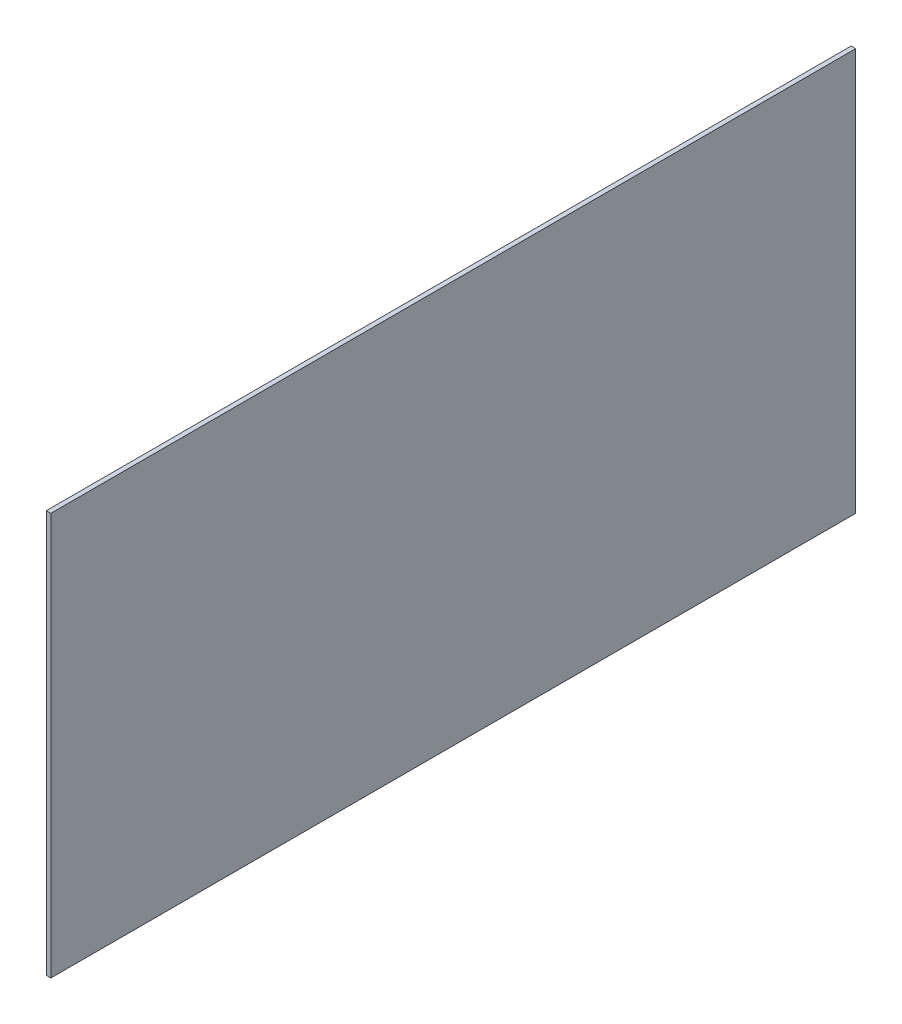
ISO-10303-21;
HEADER;
FILE_DESCRIPTION(('STEP AP214'),'2;1');
FILE_NAME('part.step','',(''),(''),'','','');
FILE_SCHEMA(('AUTOMOTIVE_DESIGN { 1 0 10303 214 1 1 1 1 }'));
ENDSEC;
DATA;
#1=APPLICATION_CONTEXT('core data for automotive mechanical design processes');
#2=APPLICATION_PROTOCOL_DEFINITION('international standard','automotive_design',2000,#1);
#3=PRODUCT_CONTEXT('',#1,'mechanical');
#4=PRODUCT('Part','Part','',(#3));
#5=PRODUCT_RELATED_PRODUCT_CATEGORY('part','',(#4));
#6=PRODUCT_DEFINITION_FORMATION('','',#4);
#7=PRODUCT_DEFINITION_CONTEXT('part definition',#1,'design');
#8=PRODUCT_DEFINITION('design','',#6,#7);
#9=PRODUCT_DEFINITION_SHAPE('','',#8);
#10=(LENGTH_UNIT() NAMED_UNIT(*) SI_UNIT(.MILLI.,.METRE.));
#11=(NAMED_UNIT(*) PLANE_ANGLE_UNIT() SI_UNIT($,.RADIAN.));
#12=(NAMED_UNIT(*) SI_UNIT($,.STERADIAN.) SOLID_ANGLE_UNIT());
#13=UNCERTAINTY_MEASURE_WITH_UNIT(LENGTH_MEASURE(1.E-05),#10,'distance_accuracy_value','');
#14=(GEOMETRIC_REPRESENTATION_CONTEXT(3) GLOBAL_UNCERTAINTY_ASSIGNED_CONTEXT((#13)) GLOBAL_UNIT_ASSIGNED_CONTEXT((#10,
#11,#12)) REPRESENTATION_CONTEXT('',''));
#15=CARTESIAN_POINT('',(0.,0.,0.));
#16=DIRECTION('',(0.,0.,1.));
#17=DIRECTION('',(1.,0.,0.));
#18=AXIS2_PLACEMENT_3D('',#15,#16,#17);
#19=CARTESIAN_POINT('',(1.5875,0.,0.));
#20=DIRECTION('',(0.,0.,-1.));
#21=DIRECTION('',(-1.,0.,0.));
#22=AXIS2_PLACEMENT_3D('',#19,#20,#21);
#23=PLANE('',#22);
#24=DIRECTION('',(0.,-1.,0.));
#25=VECTOR('',#24,1.);
#26=CARTESIAN_POINT('',(0.,0.,0.));
#27=LINE('',#26,#25);
#28=CARTESIAN_POINT('',(0.,139.7,0.));
#29=VERTEX_POINT('',#28);
#30=CARTESIAN_POINT('',(0.,0.,0.));
#31=VERTEX_POINT('',#30);
#32=EDGE_CURVE('E96',#29,#31,#27,.T.);
#33=ORIENTED_EDGE('',*,*,#32,.T.);
#34=DIRECTION('',(-1.,0.,0.));
#35=VECTOR('',#34,1.);
#36=CARTESIAN_POINT('',(1.5875,0.,0.));
#37=LINE('',#36,#35);
#38=CARTESIAN_POINT('',(1.5875,0.,0.));
#39=VERTEX_POINT('',#38);
#40=EDGE_CURVE('E11',#39,#31,#37,.T.);
#41=ORIENTED_EDGE('',*,*,#40,.F.);
#42=DIRECTION('',(0.,-1.,0.));
#43=VECTOR('',#42,1.);
#44=CARTESIAN_POINT('',(1.5875,0.,0.));
#45=LINE('',#44,#43);
#46=CARTESIAN_POINT('',(1.5875,139.7,0.));
#47=VERTEX_POINT('',#46);
#48=EDGE_CURVE('E84',#47,#39,#45,.T.);
#49=ORIENTED_EDGE('',*,*,#48,.F.);
#50=DIRECTION('',(-1.,0.,0.));
#51=VECTOR('',#50,1.);
#52=CARTESIAN_POINT('',(1.5875,139.7,0.));
#53=LINE('',#52,#51);
#54=EDGE_CURVE('E92',#47,#29,#53,.T.);
#55=ORIENTED_EDGE('',*,*,#54,.T.);
#56=EDGE_LOOP('',(#33,#41,#49,#55));
#57=FACE_BOUND('',#56,.T.);
#58=ADVANCED_FACE('F33',(#57),#23,.F.);
#59=CARTESIAN_POINT('',(1.5875,0.,0.));
#60=DIRECTION('',(0.,1.,0.));
#61=DIRECTION('',(0.,0.,1.));
#62=AXIS2_PLACEMENT_3D('',#59,#60,#61);
#63=PLANE('',#62);
#64=DIRECTION('',(0.,0.,-1.));
#65=VECTOR('',#64,1.);
#66=CARTESIAN_POINT('',(0.,0.,0.));
#67=LINE('',#66,#65);
#68=CARTESIAN_POINT('',(0.,0.,-279.4));
#69=VERTEX_POINT('',#68);
#70=EDGE_CURVE('E88',#31,#69,#67,.T.);
#71=ORIENTED_EDGE('',*,*,#70,.T.);
#72=DIRECTION('',(-1.,0.,0.));
#73=VECTOR('',#72,1.);
#74=CARTESIAN_POINT('',(1.5875,0.,-279.4));
#75=LINE('',#74,#73);
#76=CARTESIAN_POINT('',(1.5875,0.,-279.4));
#77=VERTEX_POINT('',#76);
#78=EDGE_CURVE('E41',#77,#69,#75,.T.);
#79=ORIENTED_EDGE('',*,*,#78,.F.);
#80=DIRECTION('',(0.,0.,-1.));
#81=VECTOR('',#80,1.);
#82=CARTESIAN_POINT('',(1.5875,0.,0.));
#83=LINE('',#82,#81);
#84=EDGE_CURVE('E79',#39,#77,#83,.T.);
#85=ORIENTED_EDGE('',*,*,#84,.F.);
#86=ORIENTED_EDGE('',*,*,#40,.T.);
#87=EDGE_LOOP('',(#71,#79,#85,#86));
#88=FACE_BOUND('',#87,.T.);
#89=ADVANCED_FACE('F87',(#88),#63,.F.);
#90=CARTESIAN_POINT('',(1.5875,0.,-279.4));
#91=DIRECTION('',(0.,0.,1.));
#92=DIRECTION('',(1.,0.,0.));
#93=AXIS2_PLACEMENT_3D('',#90,#91,#92);
#94=PLANE('',#93);
#95=DIRECTION('',(0.,1.,0.));
#96=VECTOR('',#95,1.);
#97=CARTESIAN_POINT('',(0.,0.,-279.4));
#98=LINE('',#97,#96);
#99=CARTESIAN_POINT('',(0.,139.7,-279.4));
#100=VERTEX_POINT('',#99);
#101=EDGE_CURVE('E66',#69,#100,#98,.T.);
#102=ORIENTED_EDGE('',*,*,#101,.T.);
#103=DIRECTION('',(-1.,0.,0.));
#104=VECTOR('',#103,1.);
#105=CARTESIAN_POINT('',(1.5875,139.7,-279.4));
#106=LINE('',#105,#104);
#107=CARTESIAN_POINT('',(1.5875,139.7,-279.4));
#108=VERTEX_POINT('',#107);
#109=EDGE_CURVE('E89',#108,#100,#106,.T.);
#110=ORIENTED_EDGE('',*,*,#109,.F.);
#111=DIRECTION('',(0.,1.,0.));
#112=VECTOR('',#111,1.);
#113=CARTESIAN_POINT('',(1.5875,0.,-279.4));
#114=LINE('',#113,#112);
#115=EDGE_CURVE('E82',#77,#108,#114,.T.);
#116=ORIENTED_EDGE('',*,*,#115,.F.);
#117=ORIENTED_EDGE('',*,*,#78,.T.);
#118=EDGE_LOOP('',(#102,#110,#116,#117));
#119=FACE_BOUND('',#118,.T.);
#120=ADVANCED_FACE('F90',(#119),#94,.F.);
#121=CARTESIAN_POINT('',(1.5875,139.7,0.));
#122=DIRECTION('',(0.,-1.,0.));
#123=DIRECTION('',(0.,0.,-1.));
#124=AXIS2_PLACEMENT_3D('',#121,#122,#123);
#125=PLANE('',#124);
#126=DIRECTION('',(0.,0.,1.));
#127=VECTOR('',#126,1.);
#128=CARTESIAN_POINT('',(0.,139.7,0.));
#129=LINE('',#128,#127);
#130=EDGE_CURVE('E72',#100,#29,#129,.T.);
#131=ORIENTED_EDGE('',*,*,#130,.T.);
#132=ORIENTED_EDGE('',*,*,#54,.F.);
#133=DIRECTION('',(0.,0.,1.));
#134=VECTOR('',#133,1.);
#135=CARTESIAN_POINT('',(1.5875,139.7,0.));
#136=LINE('',#135,#134);
#137=EDGE_CURVE('E49',#108,#47,#136,.T.);
#138=ORIENTED_EDGE('',*,*,#137,.F.);
#139=ORIENTED_EDGE('',*,*,#109,.T.);
#140=EDGE_LOOP('',(#131,#132,#138,#139));
#141=FACE_BOUND('',#140,.T.);
#142=ADVANCED_FACE('F103',(#141),#125,.F.);
#143=CARTESIAN_POINT('',(1.5875,0.,0.));
#144=DIRECTION('',(-1.,0.,0.));
#145=DIRECTION('',(0.,0.,1.));
#146=AXIS2_PLACEMENT_3D('',#143,#144,#145);
#147=PLANE('',#146);
#148=ORIENTED_EDGE('',*,*,#48,.T.);
#149=ORIENTED_EDGE('',*,*,#84,.T.);
#150=ORIENTED_EDGE('',*,*,#115,.T.);
#151=ORIENTED_EDGE('',*,*,#137,.T.);
#152=EDGE_LOOP('',(#148,#149,#150,#151));
#153=FACE_BOUND('',#152,.T.);
#154=ADVANCED_FACE('F80',(#153),#147,.F.);
#155=CARTESIAN_POINT('',(0.,0.,0.));
#156=DIRECTION('',(-1.,0.,0.));
#157=DIRECTION('',(0.,0.,1.));
#158=AXIS2_PLACEMENT_3D('',#155,#156,#157);
#159=PLANE('',#158);
#160=ORIENTED_EDGE('',*,*,#32,.F.);
#161=ORIENTED_EDGE('',*,*,#130,.F.);
#162=ORIENTED_EDGE('',*,*,#101,.F.);
#163=ORIENTED_EDGE('',*,*,#70,.F.);
#164=EDGE_LOOP('',(#160,#161,#162,#163));
#165=FACE_BOUND('',#164,.T.);
#166=ADVANCED_FACE('F106',(#165),#159,.T.);
#167=CLOSED_SHELL('',(#58,#89,#120,#142,#154,#166));
#168=MANIFOLD_SOLID_BREP('B2',#167);
#169=ADVANCED_BREP_SHAPE_REPRESENTATION('',(#18,#168),#14);
#170=SHAPE_DEFINITION_REPRESENTATION(#9,#169);
ENDSEC;
END-ISO-10303-21;
